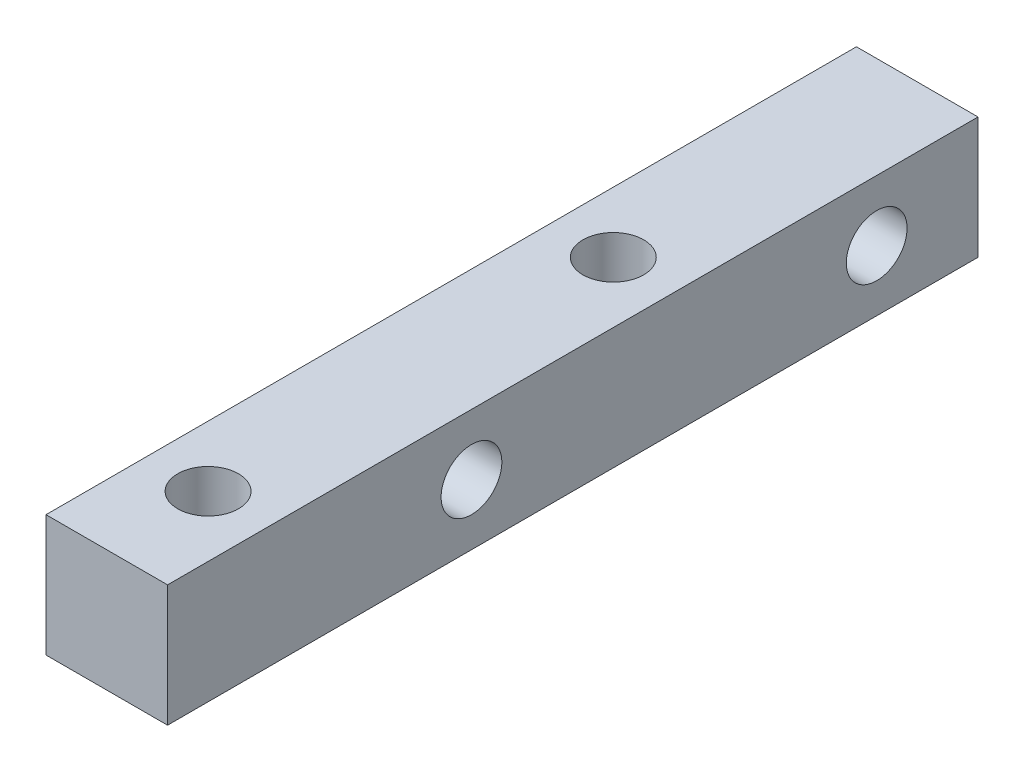
ISO-10303-21;
HEADER;
FILE_DESCRIPTION(('STEP AP214'),'2;1');
FILE_NAME('part.step','',(''),(''),'','','');
FILE_SCHEMA(('AUTOMOTIVE_DESIGN { 1 0 10303 214 1 1 1 1 }'));
ENDSEC;
DATA;
#1=APPLICATION_CONTEXT('core data for automotive mechanical design processes');
#2=APPLICATION_PROTOCOL_DEFINITION('international standard','automotive_design',2000,#1);
#3=PRODUCT_CONTEXT('',#1,'mechanical');
#4=PRODUCT('Part','Part','',(#3));
#5=PRODUCT_RELATED_PRODUCT_CATEGORY('part','',(#4));
#6=PRODUCT_DEFINITION_FORMATION('','',#4);
#7=PRODUCT_DEFINITION_CONTEXT('part definition',#1,'design');
#8=PRODUCT_DEFINITION('design','',#6,#7);
#9=PRODUCT_DEFINITION_SHAPE('','',#8);
#10=(LENGTH_UNIT() NAMED_UNIT(*) SI_UNIT(.MILLI.,.METRE.));
#11=(NAMED_UNIT(*) PLANE_ANGLE_UNIT() SI_UNIT($,.RADIAN.));
#12=(NAMED_UNIT(*) SI_UNIT($,.STERADIAN.) SOLID_ANGLE_UNIT());
#13=UNCERTAINTY_MEASURE_WITH_UNIT(LENGTH_MEASURE(1.E-05),#10,'distance_accuracy_value','');
#14=(GEOMETRIC_REPRESENTATION_CONTEXT(3) GLOBAL_UNCERTAINTY_ASSIGNED_CONTEXT((#13)) GLOBAL_UNIT_ASSIGNED_CONTEXT((#10,
#11,#12)) REPRESENTATION_CONTEXT('',''));
#15=CARTESIAN_POINT('',(0.,0.,0.));
#16=DIRECTION('',(0.,0.,1.));
#17=DIRECTION('',(1.,0.,0.));
#18=AXIS2_PLACEMENT_3D('',#15,#16,#17);
#19=CARTESIAN_POINT('',(3.,-3.,-40.));
#20=DIRECTION('',(1.,0.,0.));
#21=DIRECTION('',(0.,0.,-1.));
#22=AXIS2_PLACEMENT_3D('',#19,#20,#21);
#23=PLANE('',#22);
#24=CARTESIAN_POINT('',(3.,0.,-15.));
#25=DIRECTION('',(1.,0.,0.));
#26=DIRECTION('',(0.,0.,-1.));
#27=AXIS2_PLACEMENT_3D('',#24,#25,#26);
#28=CIRCLE('',#27,1.5);
#29=CARTESIAN_POINT('',(3.,0.,-16.5));
#30=VERTEX_POINT('',#29);
#31=EDGE_CURVE('E159',#30,#30,#28,.T.);
#32=ORIENTED_EDGE('',*,*,#31,.F.);
#33=EDGE_LOOP('',(#32));
#34=FACE_BOUND('',#33,.T.);
#35=CARTESIAN_POINT('',(3.,0.,-35.));
#36=DIRECTION('',(1.,0.,0.));
#37=DIRECTION('',(0.,0.,-1.));
#38=AXIS2_PLACEMENT_3D('',#35,#36,#37);
#39=CIRCLE('',#38,1.5);
#40=CARTESIAN_POINT('',(3.,0.,-36.5));
#41=VERTEX_POINT('',#40);
#42=EDGE_CURVE('E153',#41,#41,#39,.T.);
#43=ORIENTED_EDGE('',*,*,#42,.F.);
#44=EDGE_LOOP('',(#43));
#45=FACE_BOUND('',#44,.T.);
#46=DIRECTION('',(0.,1.,0.));
#47=VECTOR('',#46,1.);
#48=CARTESIAN_POINT('',(3.,-3.,0.));
#49=LINE('',#48,#47);
#50=CARTESIAN_POINT('',(3.,-3.,0.));
#51=VERTEX_POINT('',#50);
#52=CARTESIAN_POINT('',(3.,3.,0.));
#53=VERTEX_POINT('',#52);
#54=EDGE_CURVE('E106',#51,#53,#49,.T.);
#55=ORIENTED_EDGE('',*,*,#54,.F.);
#56=DIRECTION('',(0.,0.,1.));
#57=VECTOR('',#56,1.);
#58=CARTESIAN_POINT('',(3.,-3.,-40.));
#59=LINE('',#58,#57);
#60=CARTESIAN_POINT('',(3.,-3.,-40.));
#61=VERTEX_POINT('',#60);
#62=EDGE_CURVE('E11',#61,#51,#59,.T.);
#63=ORIENTED_EDGE('',*,*,#62,.F.);
#64=DIRECTION('',(0.,1.,0.));
#65=VECTOR('',#64,1.);
#66=CARTESIAN_POINT('',(3.,-3.,-40.));
#67=LINE('',#66,#65);
#68=CARTESIAN_POINT('',(3.,3.,-40.));
#69=VERTEX_POINT('',#68);
#70=EDGE_CURVE('E100',#61,#69,#67,.T.);
#71=ORIENTED_EDGE('',*,*,#70,.T.);
#72=DIRECTION('',(0.,0.,1.));
#73=VECTOR('',#72,1.);
#74=CARTESIAN_POINT('',(3.,3.,-40.));
#75=LINE('',#74,#73);
#76=EDGE_CURVE('E42',#69,#53,#75,.T.);
#77=ORIENTED_EDGE('',*,*,#76,.T.);
#78=EDGE_LOOP('',(#55,#63,#71,#77));
#79=FACE_BOUND('',#78,.T.);
#80=ADVANCED_FACE('F41',(#34,#45,#79),#23,.T.);
#81=CARTESIAN_POINT('',(-3.,-3.,-40.));
#82=DIRECTION('',(0.,-1.,0.));
#83=DIRECTION('',(0.,0.,-1.));
#84=AXIS2_PLACEMENT_3D('',#81,#82,#83);
#85=PLANE('',#84);
#86=CARTESIAN_POINT('',(0.,-3.,-25.));
#87=DIRECTION('',(0.,1.,0.));
#88=DIRECTION('',(0.,0.,1.));
#89=AXIS2_PLACEMENT_3D('',#86,#87,#88);
#90=CIRCLE('',#89,1.5);
#91=CARTESIAN_POINT('',(0.,-3.,-23.5));
#92=VERTEX_POINT('',#91);
#93=EDGE_CURVE('E154',#92,#92,#90,.T.);
#94=ORIENTED_EDGE('',*,*,#93,.T.);
#95=EDGE_LOOP('',(#94));
#96=FACE_BOUND('',#95,.T.);
#97=CARTESIAN_POINT('',(0.,-3.,-5.));
#98=DIRECTION('',(0.,1.,0.));
#99=DIRECTION('',(0.,0.,1.));
#100=AXIS2_PLACEMENT_3D('',#97,#98,#99);
#101=CIRCLE('',#100,1.5);
#102=CARTESIAN_POINT('',(0.,-3.,-3.5));
#103=VERTEX_POINT('',#102);
#104=EDGE_CURVE('E109',#103,#103,#101,.T.);
#105=ORIENTED_EDGE('',*,*,#104,.T.);
#106=EDGE_LOOP('',(#105));
#107=FACE_BOUND('',#106,.T.);
#108=DIRECTION('',(1.,0.,0.));
#109=VECTOR('',#108,1.);
#110=CARTESIAN_POINT('',(-3.,-3.,0.));
#111=LINE('',#110,#109);
#112=CARTESIAN_POINT('',(-3.,-3.,0.));
#113=VERTEX_POINT('',#112);
#114=EDGE_CURVE('E103',#113,#51,#111,.T.);
#115=ORIENTED_EDGE('',*,*,#114,.F.);
#116=DIRECTION('',(0.,0.,1.));
#117=VECTOR('',#116,1.);
#118=CARTESIAN_POINT('',(-3.,-3.,-40.));
#119=LINE('',#118,#117);
#120=CARTESIAN_POINT('',(-3.,-3.,-40.));
#121=VERTEX_POINT('',#120);
#122=EDGE_CURVE('E49',#121,#113,#119,.T.);
#123=ORIENTED_EDGE('',*,*,#122,.F.);
#124=DIRECTION('',(1.,0.,0.));
#125=VECTOR('',#124,1.);
#126=CARTESIAN_POINT('',(-3.,-3.,-40.));
#127=LINE('',#126,#125);
#128=EDGE_CURVE('E98',#121,#61,#127,.T.);
#129=ORIENTED_EDGE('',*,*,#128,.T.);
#130=ORIENTED_EDGE('',*,*,#62,.T.);
#131=EDGE_LOOP('',(#115,#123,#129,#130));
#132=FACE_BOUND('',#131,.T.);
#133=ADVANCED_FACE('F120',(#96,#107,#132),#85,.T.);
#134=CARTESIAN_POINT('',(-3.,-3.,-40.));
#135=DIRECTION('',(-1.,0.,0.));
#136=DIRECTION('',(0.,0.,1.));
#137=AXIS2_PLACEMENT_3D('',#134,#135,#136);
#138=PLANE('',#137);
#139=CARTESIAN_POINT('',(-3.,0.,-15.));
#140=DIRECTION('',(1.,0.,0.));
#141=DIRECTION('',(0.,0.,-1.));
#142=AXIS2_PLACEMENT_3D('',#139,#140,#141);
#143=CIRCLE('',#142,1.5);
#144=CARTESIAN_POINT('',(-3.,0.,-16.5));
#145=VERTEX_POINT('',#144);
#146=EDGE_CURVE('E157',#145,#145,#143,.T.);
#147=ORIENTED_EDGE('',*,*,#146,.T.);
#148=EDGE_LOOP('',(#147));
#149=FACE_BOUND('',#148,.T.);
#150=CARTESIAN_POINT('',(-3.,0.,-35.));
#151=DIRECTION('',(1.,0.,0.));
#152=DIRECTION('',(0.,0.,-1.));
#153=AXIS2_PLACEMENT_3D('',#150,#151,#152);
#154=CIRCLE('',#153,1.5);
#155=CARTESIAN_POINT('',(-3.,0.,-36.5));
#156=VERTEX_POINT('',#155);
#157=EDGE_CURVE('E150',#156,#156,#154,.T.);
#158=ORIENTED_EDGE('',*,*,#157,.T.);
#159=EDGE_LOOP('',(#158));
#160=FACE_BOUND('',#159,.T.);
#161=DIRECTION('',(0.,-1.,0.));
#162=VECTOR('',#161,1.);
#163=CARTESIAN_POINT('',(-3.,-3.,0.));
#164=LINE('',#163,#162);
#165=CARTESIAN_POINT('',(-3.,3.,0.));
#166=VERTEX_POINT('',#165);
#167=EDGE_CURVE('E91',#166,#113,#164,.T.);
#168=ORIENTED_EDGE('',*,*,#167,.F.);
#169=DIRECTION('',(0.,0.,1.));
#170=VECTOR('',#169,1.);
#171=CARTESIAN_POINT('',(-3.,3.,-40.));
#172=LINE('',#171,#170);
#173=CARTESIAN_POINT('',(-3.,3.,-40.));
#174=VERTEX_POINT('',#173);
#175=EDGE_CURVE('E88',#174,#166,#172,.T.);
#176=ORIENTED_EDGE('',*,*,#175,.F.);
#177=DIRECTION('',(0.,-1.,0.));
#178=VECTOR('',#177,1.);
#179=CARTESIAN_POINT('',(-3.,-3.,-40.));
#180=LINE('',#179,#178);
#181=EDGE_CURVE('E87',#174,#121,#180,.T.);
#182=ORIENTED_EDGE('',*,*,#181,.T.);
#183=ORIENTED_EDGE('',*,*,#122,.T.);
#184=EDGE_LOOP('',(#168,#176,#182,#183));
#185=FACE_BOUND('',#184,.T.);
#186=ADVANCED_FACE('F86',(#149,#160,#185),#138,.T.);
#187=CARTESIAN_POINT('',(-3.,3.,-40.));
#188=DIRECTION('',(0.,1.,0.));
#189=DIRECTION('',(0.,0.,1.));
#190=AXIS2_PLACEMENT_3D('',#187,#188,#189);
#191=PLANE('',#190);
#192=CARTESIAN_POINT('',(0.,3.,-25.));
#193=DIRECTION('',(0.,1.,0.));
#194=DIRECTION('',(0.,0.,1.));
#195=AXIS2_PLACEMENT_3D('',#192,#193,#194);
#196=CIRCLE('',#195,1.5);
#197=CARTESIAN_POINT('',(0.,3.,-23.5));
#198=VERTEX_POINT('',#197);
#199=EDGE_CURVE('E145',#198,#198,#196,.T.);
#200=ORIENTED_EDGE('',*,*,#199,.F.);
#201=EDGE_LOOP('',(#200));
#202=FACE_BOUND('',#201,.T.);
#203=CARTESIAN_POINT('',(0.,3.,-5.));
#204=DIRECTION('',(0.,1.,0.));
#205=DIRECTION('',(0.,0.,1.));
#206=AXIS2_PLACEMENT_3D('',#203,#204,#205);
#207=CIRCLE('',#206,1.5);
#208=CARTESIAN_POINT('',(0.,3.,-3.5));
#209=VERTEX_POINT('',#208);
#210=EDGE_CURVE('E143',#209,#209,#207,.T.);
#211=ORIENTED_EDGE('',*,*,#210,.F.);
#212=EDGE_LOOP('',(#211));
#213=FACE_BOUND('',#212,.T.);
#214=DIRECTION('',(-1.,0.,0.));
#215=VECTOR('',#214,1.);
#216=CARTESIAN_POINT('',(-3.,3.,0.));
#217=LINE('',#216,#215);
#218=EDGE_CURVE('E107',#53,#166,#217,.T.);
#219=ORIENTED_EDGE('',*,*,#218,.F.);
#220=ORIENTED_EDGE('',*,*,#76,.F.);
#221=DIRECTION('',(-1.,0.,0.));
#222=VECTOR('',#221,1.);
#223=CARTESIAN_POINT('',(-3.,3.,-40.));
#224=LINE('',#223,#222);
#225=EDGE_CURVE('E94',#69,#174,#224,.T.);
#226=ORIENTED_EDGE('',*,*,#225,.T.);
#227=ORIENTED_EDGE('',*,*,#175,.T.);
#228=EDGE_LOOP('',(#219,#220,#226,#227));
#229=FACE_BOUND('',#228,.T.);
#230=ADVANCED_FACE('F96',(#202,#213,#229),#191,.T.);
#231=CARTESIAN_POINT('',(0.,0.,-40.));
#232=DIRECTION('',(0.,0.,-1.));
#233=DIRECTION('',(-1.,0.,0.));
#234=AXIS2_PLACEMENT_3D('',#231,#232,#233);
#235=PLANE('',#234);
#236=ORIENTED_EDGE('',*,*,#70,.F.);
#237=ORIENTED_EDGE('',*,*,#128,.F.);
#238=ORIENTED_EDGE('',*,*,#181,.F.);
#239=ORIENTED_EDGE('',*,*,#225,.F.);
#240=EDGE_LOOP('',(#236,#237,#238,#239));
#241=FACE_BOUND('',#240,.T.);
#242=ADVANCED_FACE('F93',(#241),#235,.T.);
#243=CARTESIAN_POINT('',(0.,0.,0.));
#244=DIRECTION('',(0.,0.,-1.));
#245=DIRECTION('',(-1.,0.,0.));
#246=AXIS2_PLACEMENT_3D('',#243,#244,#245);
#247=PLANE('',#246);
#248=ORIENTED_EDGE('',*,*,#54,.T.);
#249=ORIENTED_EDGE('',*,*,#218,.T.);
#250=ORIENTED_EDGE('',*,*,#167,.T.);
#251=ORIENTED_EDGE('',*,*,#114,.T.);
#252=EDGE_LOOP('',(#248,#249,#250,#251));
#253=FACE_BOUND('',#252,.T.);
#254=ADVANCED_FACE('F116',(#253),#247,.F.);
#255=CARTESIAN_POINT('',(0.,-3.,-5.));
#256=DIRECTION('',(0.,1.,0.));
#257=DIRECTION('',(0.,0.,1.));
#258=AXIS2_PLACEMENT_3D('',#255,#256,#257);
#259=CYLINDRICAL_SURFACE('',#258,1.5);
#260=ORIENTED_EDGE('',*,*,#104,.F.);
#261=EDGE_LOOP('',(#260));
#262=FACE_BOUND('',#261,.T.);
#263=ORIENTED_EDGE('',*,*,#210,.T.);
#264=EDGE_LOOP('',(#263));
#265=FACE_BOUND('',#264,.T.);
#266=ADVANCED_FACE('F180',(#262,#265),#259,.F.);
#267=CARTESIAN_POINT('',(-3.,0.,-35.));
#268=DIRECTION('',(1.,0.,0.));
#269=DIRECTION('',(0.,0.,-1.));
#270=AXIS2_PLACEMENT_3D('',#267,#268,#269);
#271=CYLINDRICAL_SURFACE('',#270,1.5);
#272=ORIENTED_EDGE('',*,*,#157,.F.);
#273=EDGE_LOOP('',(#272));
#274=FACE_BOUND('',#273,.T.);
#275=ORIENTED_EDGE('',*,*,#42,.T.);
#276=EDGE_LOOP('',(#275));
#277=FACE_BOUND('',#276,.T.);
#278=ADVANCED_FACE('F176',(#274,#277),#271,.F.);
#279=CARTESIAN_POINT('',(0.,-3.,-25.));
#280=DIRECTION('',(0.,1.,0.));
#281=DIRECTION('',(0.,0.,1.));
#282=AXIS2_PLACEMENT_3D('',#279,#280,#281);
#283=CYLINDRICAL_SURFACE('',#282,1.5);
#284=ORIENTED_EDGE('',*,*,#93,.F.);
#285=EDGE_LOOP('',(#284));
#286=FACE_BOUND('',#285,.T.);
#287=ORIENTED_EDGE('',*,*,#199,.T.);
#288=EDGE_LOOP('',(#287));
#289=FACE_BOUND('',#288,.T.);
#290=ADVANCED_FACE('F167',(#286,#289),#283,.F.);
#291=CARTESIAN_POINT('',(-3.,0.,-15.));
#292=DIRECTION('',(1.,0.,0.));
#293=DIRECTION('',(0.,0.,-1.));
#294=AXIS2_PLACEMENT_3D('',#291,#292,#293);
#295=CYLINDRICAL_SURFACE('',#294,1.5);
#296=ORIENTED_EDGE('',*,*,#146,.F.);
#297=EDGE_LOOP('',(#296));
#298=FACE_BOUND('',#297,.T.);
#299=ORIENTED_EDGE('',*,*,#31,.T.);
#300=EDGE_LOOP('',(#299));
#301=FACE_BOUND('',#300,.T.);
#302=ADVANCED_FACE('F170',(#298,#301),#295,.F.);
#303=CLOSED_SHELL('',(#80,#133,#186,#230,#242,#254,#266,#278,#290,#302));
#304=MANIFOLD_SOLID_BREP('B2',#303);
#305=ADVANCED_BREP_SHAPE_REPRESENTATION('',(#18,#304),#14);
#306=SHAPE_DEFINITION_REPRESENTATION(#9,#305);
ENDSEC;
END-ISO-10303-21;
